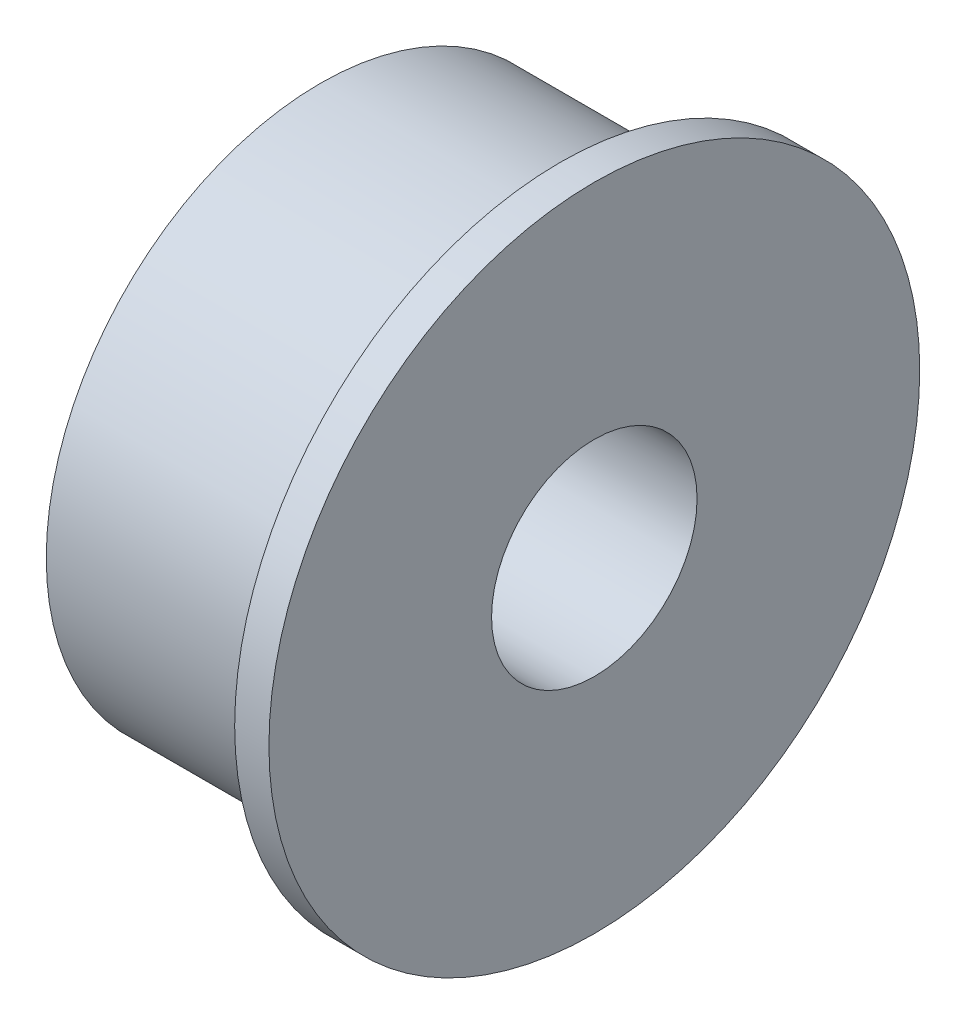
ISO-10303-21;
HEADER;
FILE_DESCRIPTION(('STEP AP214'),'2;1');
FILE_NAME('part.step','',(''),(''),'','','');
FILE_SCHEMA(('AUTOMOTIVE_DESIGN { 1 0 10303 214 1 1 1 1 }'));
ENDSEC;
DATA;
#1=APPLICATION_CONTEXT('core data for automotive mechanical design processes');
#2=APPLICATION_PROTOCOL_DEFINITION('international standard','automotive_design',2000,#1);
#3=PRODUCT_CONTEXT('',#1,'mechanical');
#4=PRODUCT('Part','Part','',(#3));
#5=PRODUCT_RELATED_PRODUCT_CATEGORY('part','',(#4));
#6=PRODUCT_DEFINITION_FORMATION('','',#4);
#7=PRODUCT_DEFINITION_CONTEXT('part definition',#1,'design');
#8=PRODUCT_DEFINITION('design','',#6,#7);
#9=PRODUCT_DEFINITION_SHAPE('','',#8);
#10=(LENGTH_UNIT() NAMED_UNIT(*) SI_UNIT(.MILLI.,.METRE.));
#11=(NAMED_UNIT(*) PLANE_ANGLE_UNIT() SI_UNIT($,.RADIAN.));
#12=(NAMED_UNIT(*) SI_UNIT($,.STERADIAN.) SOLID_ANGLE_UNIT());
#13=UNCERTAINTY_MEASURE_WITH_UNIT(LENGTH_MEASURE(1.E-05),#10,'distance_accuracy_value','');
#14=(GEOMETRIC_REPRESENTATION_CONTEXT(3) GLOBAL_UNCERTAINTY_ASSIGNED_CONTEXT((#13)) GLOBAL_UNIT_ASSIGNED_CONTEXT((#10,
#11,#12)) REPRESENTATION_CONTEXT('',''));
#15=CARTESIAN_POINT('',(0.,0.,0.));
#16=DIRECTION('',(0.,0.,1.));
#17=DIRECTION('',(1.,0.,0.));
#18=AXIS2_PLACEMENT_3D('',#15,#16,#17);
#19=CARTESIAN_POINT('',(0.,4.,0.));
#20=DIRECTION('',(1.,0.,0.));
#21=DIRECTION('',(0.,0.,-1.));
#22=AXIS2_PLACEMENT_3D('',#19,#20,#21);
#23=PLANE('',#22);
#24=CARTESIAN_POINT('',(0.,0.,0.));
#25=DIRECTION('',(-1.,0.,0.));
#26=DIRECTION('',(0.,0.,1.));
#27=AXIS2_PLACEMENT_3D('',#24,#25,#26);
#28=CIRCLE('',#27,1.5);
#29=CARTESIAN_POINT('',(0.,0.,1.5));
#30=VERTEX_POINT('',#29);
#31=EDGE_CURVE('E10',#30,#30,#28,.T.);
#32=ORIENTED_EDGE('',*,*,#31,.F.);
#33=EDGE_LOOP('',(#32));
#34=FACE_BOUND('',#33,.T.);
#35=CARTESIAN_POINT('',(0.,0.,0.));
#36=DIRECTION('',(-1.,0.,0.));
#37=DIRECTION('',(0.,0.,1.));
#38=AXIS2_PLACEMENT_3D('',#35,#36,#37);
#39=CIRCLE('',#38,4.);
#40=CARTESIAN_POINT('',(0.,0.,4.));
#41=VERTEX_POINT('',#40);
#42=EDGE_CURVE('E64',#41,#41,#39,.T.);
#43=ORIENTED_EDGE('',*,*,#42,.T.);
#44=EDGE_LOOP('',(#43));
#45=FACE_BOUND('',#44,.T.);
#46=ADVANCED_FACE('F37',(#34,#45),#23,.F.);
#47=CARTESIAN_POINT('',(0.,0.,0.));
#48=DIRECTION('',(-1.,0.,0.));
#49=DIRECTION('',(0.,0.,1.));
#50=AXIS2_PLACEMENT_3D('',#47,#48,#49);
#51=CYLINDRICAL_SURFACE('',#50,1.5);
#52=CARTESIAN_POINT('',(4.,0.,0.));
#53=DIRECTION('',(-1.,0.,0.));
#54=DIRECTION('',(0.,0.,1.));
#55=AXIS2_PLACEMENT_3D('',#52,#53,#54);
#56=CIRCLE('',#55,1.5);
#57=CARTESIAN_POINT('',(4.,0.,1.5));
#58=VERTEX_POINT('',#57);
#59=EDGE_CURVE('E44',#58,#58,#56,.T.);
#60=ORIENTED_EDGE('',*,*,#59,.F.);
#61=EDGE_LOOP('',(#60));
#62=FACE_BOUND('',#61,.T.);
#63=ORIENTED_EDGE('',*,*,#31,.T.);
#64=EDGE_LOOP('',(#63));
#65=FACE_BOUND('',#64,.T.);
#66=ADVANCED_FACE('F90',(#62,#65),#51,.F.);
#67=CARTESIAN_POINT('',(4.,1.5,0.));
#68=DIRECTION('',(-1.,0.,0.));
#69=DIRECTION('',(0.,0.,1.));
#70=AXIS2_PLACEMENT_3D('',#67,#68,#69);
#71=PLANE('',#70);
#72=CARTESIAN_POINT('',(4.,0.,0.));
#73=DIRECTION('',(-1.,0.,0.));
#74=DIRECTION('',(0.,0.,1.));
#75=AXIS2_PLACEMENT_3D('',#72,#73,#74);
#76=CIRCLE('',#75,4.75);
#77=CARTESIAN_POINT('',(4.,0.,4.75));
#78=VERTEX_POINT('',#77);
#79=EDGE_CURVE('E49',#78,#78,#76,.T.);
#80=ORIENTED_EDGE('',*,*,#79,.F.);
#81=EDGE_LOOP('',(#80));
#82=FACE_BOUND('',#81,.T.);
#83=ORIENTED_EDGE('',*,*,#59,.T.);
#84=EDGE_LOOP('',(#83));
#85=FACE_BOUND('',#84,.T.);
#86=ADVANCED_FACE('F85',(#82,#85),#71,.F.);
#87=CARTESIAN_POINT('',(0.,0.,0.));
#88=DIRECTION('',(-1.,0.,0.));
#89=DIRECTION('',(0.,0.,1.));
#90=AXIS2_PLACEMENT_3D('',#87,#88,#89);
#91=CYLINDRICAL_SURFACE('',#90,4.75);
#92=CARTESIAN_POINT('',(3.5,0.,0.));
#93=DIRECTION('',(-1.,0.,0.));
#94=DIRECTION('',(0.,0.,1.));
#95=AXIS2_PLACEMENT_3D('',#92,#93,#94);
#96=CIRCLE('',#95,4.75);
#97=CARTESIAN_POINT('',(3.5,0.,4.75));
#98=VERTEX_POINT('',#97);
#99=EDGE_CURVE('E54',#98,#98,#96,.T.);
#100=ORIENTED_EDGE('',*,*,#99,.F.);
#101=EDGE_LOOP('',(#100));
#102=FACE_BOUND('',#101,.T.);
#103=ORIENTED_EDGE('',*,*,#79,.T.);
#104=EDGE_LOOP('',(#103));
#105=FACE_BOUND('',#104,.T.);
#106=ADVANCED_FACE('F79',(#102,#105),#91,.T.);
#107=CARTESIAN_POINT('',(3.5,4.75,0.));
#108=DIRECTION('',(1.,0.,0.));
#109=DIRECTION('',(0.,0.,-1.));
#110=AXIS2_PLACEMENT_3D('',#107,#108,#109);
#111=PLANE('',#110);
#112=CARTESIAN_POINT('',(3.5,0.,0.));
#113=DIRECTION('',(-1.,0.,0.));
#114=DIRECTION('',(0.,0.,1.));
#115=AXIS2_PLACEMENT_3D('',#112,#113,#114);
#116=CIRCLE('',#115,4.);
#117=CARTESIAN_POINT('',(3.5,0.,4.));
#118=VERTEX_POINT('',#117);
#119=EDGE_CURVE('E60',#118,#118,#116,.T.);
#120=ORIENTED_EDGE('',*,*,#119,.F.);
#121=EDGE_LOOP('',(#120));
#122=FACE_BOUND('',#121,.T.);
#123=ORIENTED_EDGE('',*,*,#99,.T.);
#124=EDGE_LOOP('',(#123));
#125=FACE_BOUND('',#124,.T.);
#126=ADVANCED_FACE('F73',(#122,#125),#111,.F.);
#127=CARTESIAN_POINT('',(0.,0.,0.));
#128=DIRECTION('',(-1.,0.,0.));
#129=DIRECTION('',(0.,0.,1.));
#130=AXIS2_PLACEMENT_3D('',#127,#128,#129);
#131=CYLINDRICAL_SURFACE('',#130,4.);
#132=ORIENTED_EDGE('',*,*,#42,.F.);
#133=EDGE_LOOP('',(#132));
#134=FACE_BOUND('',#133,.T.);
#135=ORIENTED_EDGE('',*,*,#119,.T.);
#136=EDGE_LOOP('',(#135));
#137=FACE_BOUND('',#136,.T.);
#138=ADVANCED_FACE('F70',(#134,#137),#131,.T.);
#139=CLOSED_SHELL('',(#46,#66,#86,#106,#126,#138));
#140=MANIFOLD_SOLID_BREP('B2',#139);
#141=ADVANCED_BREP_SHAPE_REPRESENTATION('',(#18,#140),#14);
#142=SHAPE_DEFINITION_REPRESENTATION(#9,#141);
ENDSEC;
END-ISO-10303-21;
